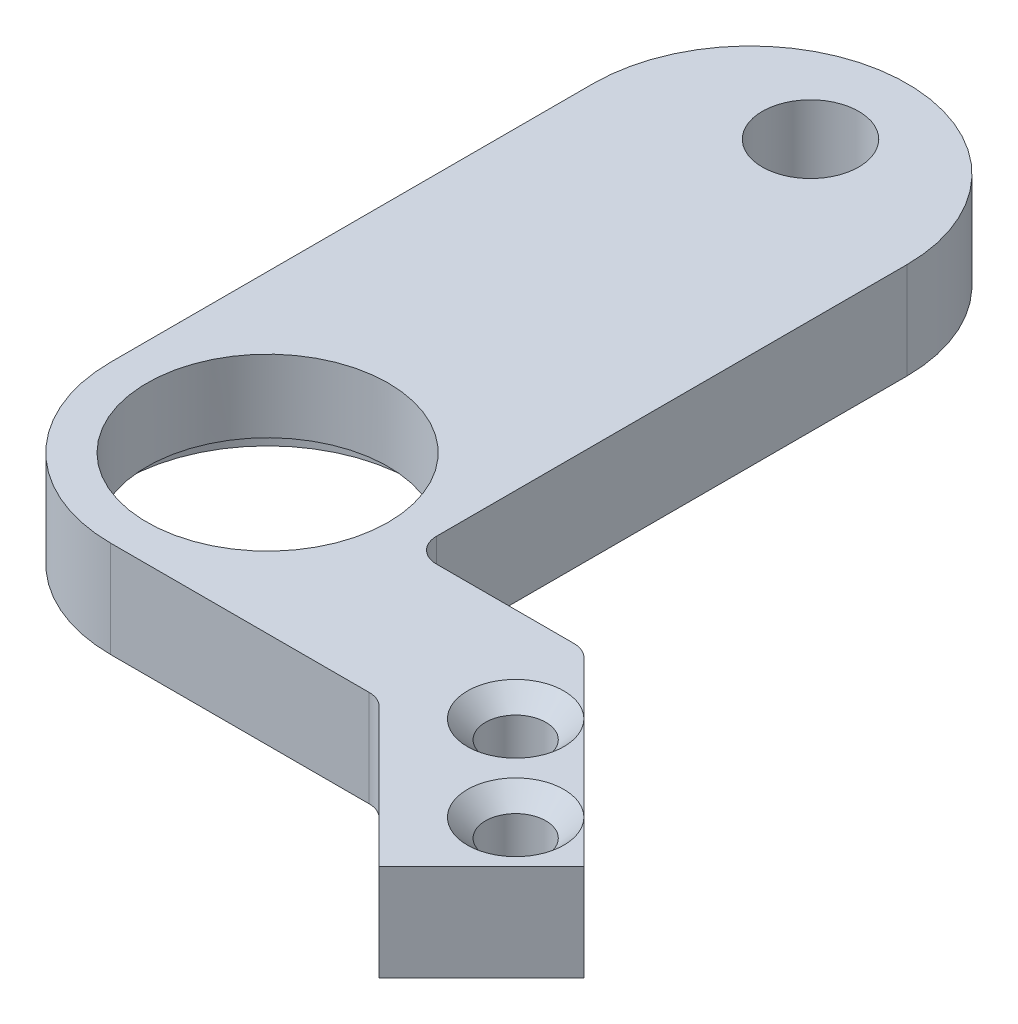
ISO-10303-21;
HEADER;
FILE_DESCRIPTION(('STEP AP214'),'2;1');
FILE_NAME('part.step','',(''),(''),'','','');
FILE_SCHEMA(('AUTOMOTIVE_DESIGN { 1 0 10303 214 1 1 1 1 }'));
ENDSEC;
DATA;
#1=APPLICATION_CONTEXT('core data for automotive mechanical design processes');
#2=APPLICATION_PROTOCOL_DEFINITION('international standard','automotive_design',2000,#1);
#3=PRODUCT_CONTEXT('',#1,'mechanical');
#4=PRODUCT('Part','Part','',(#3));
#5=PRODUCT_RELATED_PRODUCT_CATEGORY('part','',(#4));
#6=PRODUCT_DEFINITION_FORMATION('','',#4);
#7=PRODUCT_DEFINITION_CONTEXT('part definition',#1,'design');
#8=PRODUCT_DEFINITION('design','',#6,#7);
#9=PRODUCT_DEFINITION_SHAPE('','',#8);
#10=(LENGTH_UNIT() NAMED_UNIT(*) SI_UNIT(.MILLI.,.METRE.));
#11=(NAMED_UNIT(*) PLANE_ANGLE_UNIT() SI_UNIT($,.RADIAN.));
#12=(NAMED_UNIT(*) SI_UNIT($,.STERADIAN.) SOLID_ANGLE_UNIT());
#13=UNCERTAINTY_MEASURE_WITH_UNIT(LENGTH_MEASURE(1.E-05),#10,'distance_accuracy_value','');
#14=(GEOMETRIC_REPRESENTATION_CONTEXT(3) GLOBAL_UNCERTAINTY_ASSIGNED_CONTEXT((#13)) GLOBAL_UNIT_ASSIGNED_CONTEXT((#10,
#11,#12)) REPRESENTATION_CONTEXT('',''));
#15=CARTESIAN_POINT('',(0.,0.,0.));
#16=DIRECTION('',(0.,0.,1.));
#17=DIRECTION('',(1.,0.,0.));
#18=AXIS2_PLACEMENT_3D('',#15,#16,#17);
#19=CARTESIAN_POINT('',(2.53296168761796E-09,2.,0.));
#20=DIRECTION('',(0.,-1.,0.));
#21=DIRECTION('',(0.,0.,-1.));
#22=AXIS2_PLACEMENT_3D('',#19,#20,#21);
#23=PLANE('',#22);
#24=CARTESIAN_POINT('',(0.,2.,20.));
#25=DIRECTION('',(0.,-1.,0.));
#26=DIRECTION('',(0.,0.,-1.));
#27=AXIS2_PLACEMENT_3D('',#24,#25,#26);
#28=CIRCLE('',#27,5.);
#29=CARTESIAN_POINT('',(0.,2.,15.));
#30=VERTEX_POINT('',#29);
#31=EDGE_CURVE('E189',#30,#30,#28,.T.);
#32=ORIENTED_EDGE('',*,*,#31,.T.);
#33=EDGE_LOOP('',(#32));
#34=FACE_BOUND('',#33,.T.);
#35=CARTESIAN_POINT('',(0.,2.,-2.5));
#36=DIRECTION('',(0.,1.,0.));
#37=DIRECTION('',(0.,0.,1.));
#38=AXIS2_PLACEMENT_3D('',#35,#36,#37);
#39=CIRCLE('',#38,2.);
#40=CARTESIAN_POINT('',(0.,2.,-0.5));
#41=VERTEX_POINT('',#40);
#42=EDGE_CURVE('E250',#41,#41,#39,.T.);
#43=ORIENTED_EDGE('',*,*,#42,.F.);
#44=EDGE_LOOP('',(#43));
#45=FACE_BOUND('',#44,.T.);
#46=DIRECTION('',(0.707106781233644,0.,0.707106781139451));
#47=VECTOR('',#46,1.);
#48=CARTESIAN_POINT('',(-3.44519957965949,2.,3.44519958265138));
#49=LINE('',#48,#47);
#50=CARTESIAN_POINT('',(19.6421356238217,2.,26.5325347830571));
#51=VERTEX_POINT('',#50);
#52=CARTESIAN_POINT('',(21.409902577,2.,28.300301736));
#53=VERTEX_POINT('',#52);
#54=EDGE_CURVE('E156',#51,#53,#49,.T.);
#55=ORIENTED_EDGE('',*,*,#54,.F.);
#56=CARTESIAN_POINT('',(18.2279220615428,2.,27.9467483455244));
#57=DIRECTION('',(0.,1.,0.));
#58=DIRECTION('',(0.,0.,1.));
#59=AXIS2_PLACEMENT_3D('',#56,#57,#58);
#60=CIRCLE('',#59,2.);
#61=EDGE_CURVE('E45',#51,#51,#60,.T.);
#62=ORIENTED_EDGE('',*,*,#61,.F.);
#63=CARTESIAN_POINT('',(16.1066017176535,2.,22.9970008773599));
#64=VERTEX_POINT('',#63);
#65=EDGE_CURVE('E186',#64,#51,#49,.T.);
#66=ORIENTED_EDGE('',*,*,#65,.F.);
#67=CARTESIAN_POINT('',(14.6923881553746,2.,24.4112144398272));
#68=DIRECTION('',(0.,1.,0.));
#69=DIRECTION('',(0.,0.,1.));
#70=AXIS2_PLACEMENT_3D('',#67,#68,#69);
#71=CIRCLE('',#70,2.);
#72=EDGE_CURVE('E50',#64,#64,#71,.T.);
#73=ORIENTED_EDGE('',*,*,#72,.F.);
#74=CARTESIAN_POINT('',(13.9024940587664,2.,20.7928932187664));
#75=VERTEX_POINT('',#74);
#76=EDGE_CURVE('E159',#75,#64,#49,.T.);
#77=ORIENTED_EDGE('',*,*,#76,.F.);
#78=CARTESIAN_POINT('',(13.1953872776269,2.,21.5));
#79=DIRECTION('',(0.,-1.,0.));
#80=DIRECTION('',(0.,0.,-1.));
#81=AXIS2_PLACEMENT_3D('',#78,#79,#80);
#82=CIRCLE('',#81,0.999999999999998);
#83=CARTESIAN_POINT('',(13.1953872776269,2.,20.5));
#84=VERTEX_POINT('',#83);
#85=EDGE_CURVE('E213',#75,#84,#82,.F.);
#86=ORIENTED_EDGE('',*,*,#85,.T.);
#87=DIRECTION('',(1.,0.,0.));
#88=VECTOR('',#87,1.);
#89=CARTESIAN_POINT('',(6.50000000506592,2.,20.5));
#90=LINE('',#89,#88);
#91=CARTESIAN_POINT('',(7.50000000506592,2.,20.5));
#92=VERTEX_POINT('',#91);
#93=EDGE_CURVE('E150',#92,#84,#90,.T.);
#94=ORIENTED_EDGE('',*,*,#93,.F.);
#95=CARTESIAN_POINT('',(7.50000000506592,2.,19.5));
#96=DIRECTION('',(0.,-1.,0.));
#97=DIRECTION('',(0.,0.,-1.));
#98=AXIS2_PLACEMENT_3D('',#95,#96,#97);
#99=CIRCLE('',#98,0.999999999999998);
#100=CARTESIAN_POINT('',(6.50000000506592,2.,19.5));
#101=VERTEX_POINT('',#100);
#102=EDGE_CURVE('E217',#92,#101,#99,.T.);
#103=ORIENTED_EDGE('',*,*,#102,.T.);
#104=DIRECTION('',(0.,0.,1.));
#105=VECTOR('',#104,1.);
#106=CARTESIAN_POINT('',(6.50000000506592,2.,0.));
#107=LINE('',#106,#105);
#108=CARTESIAN_POINT('',(6.50000000506592,2.,0.));
#109=VERTEX_POINT('',#108);
#110=EDGE_CURVE('E148',#109,#101,#107,.T.);
#111=ORIENTED_EDGE('',*,*,#110,.F.);
#112=CARTESIAN_POINT('',(2.53296168761796E-09,2.,0.));
#113=DIRECTION('',(0.,-1.,0.));
#114=DIRECTION('',(0.,0.,-1.));
#115=AXIS2_PLACEMENT_3D('',#112,#113,#114);
#116=CIRCLE('',#115,6.50000000253296);
#117=CARTESIAN_POINT('',(-6.5,2.,0.));
#118=VERTEX_POINT('',#117);
#119=EDGE_CURVE('E134',#118,#109,#116,.T.);
#120=ORIENTED_EDGE('',*,*,#119,.F.);
#121=DIRECTION('',(0.,0.,-1.));
#122=VECTOR('',#121,1.);
#123=CARTESIAN_POINT('',(-6.5,2.,26.5));
#124=LINE('',#123,#122);
#125=CARTESIAN_POINT('',(-6.5,2.,20.));
#126=VERTEX_POINT('',#125);
#127=EDGE_CURVE('E124',#126,#118,#124,.T.);
#128=ORIENTED_EDGE('',*,*,#127,.F.);
#129=CARTESIAN_POINT('',(0.,2.,20.));
#130=DIRECTION('',(0.,-1.,0.));
#131=DIRECTION('',(0.,0.,-1.));
#132=AXIS2_PLACEMENT_3D('',#129,#130,#131);
#133=CIRCLE('',#132,6.5);
#134=CARTESIAN_POINT('',(0.,2.,26.5));
#135=VERTEX_POINT('',#134);
#136=EDGE_CURVE('E11',#126,#135,#133,.F.);
#137=ORIENTED_EDGE('',*,*,#136,.T.);
#138=DIRECTION('',(-1.,0.,0.));
#139=VECTOR('',#138,1.);
#140=CARTESIAN_POINT('',(11.1243194659491,2.,26.5));
#141=LINE('',#140,#139);
#142=CARTESIAN_POINT('',(10.7101059036269,2.,26.5));
#143=VERTEX_POINT('',#142);
#144=EDGE_CURVE('E135',#143,#135,#141,.T.);
#145=ORIENTED_EDGE('',*,*,#144,.F.);
#146=CARTESIAN_POINT('',(10.7101059036269,2.,27.5));
#147=DIRECTION('',(0.,-1.,0.));
#148=DIRECTION('',(0.,0.,-1.));
#149=AXIS2_PLACEMENT_3D('',#146,#147,#148);
#150=CIRCLE('',#149,0.999999999999998);
#151=CARTESIAN_POINT('',(11.417212684752,2.,26.792893218752));
#152=VERTEX_POINT('',#151);
#153=EDGE_CURVE('E221',#143,#152,#150,.T.);
#154=ORIENTED_EDGE('',*,*,#153,.T.);
#155=DIRECTION('',(-0.707106781248037,0.,-0.707106781125058));
#156=VECTOR('',#155,1.);
#157=CARTESIAN_POINT('',(-7.68784026672636,2.,7.68784027059639));
#158=LINE('',#157,#156);
#159=CARTESIAN_POINT('',(17.16726189,2.,32.542942423));
#160=VERTEX_POINT('',#159);
#161=EDGE_CURVE('E177',#160,#152,#158,.T.);
#162=ORIENTED_EDGE('',*,*,#161,.F.);
#163=DIRECTION('',(-0.707106781186546,0.,0.707106781186548));
#164=VECTOR('',#163,1.);
#165=CARTESIAN_POINT('',(13.609600839961,2.,36.100603473039));
#166=LINE('',#165,#164);
#167=EDGE_CURVE('E143',#53,#160,#166,.T.);
#168=ORIENTED_EDGE('',*,*,#167,.F.);
#169=EDGE_LOOP('',(#55,#62,#66,#73,#77,#86,#94,#103,#111,#120,#128,#137,#145,#154,#162,#168));
#170=FACE_BOUND('',#169,.T.);
#171=ADVANCED_FACE('F32',(#34,#45,#170),#23,.F.);
#172=CARTESIAN_POINT('',(11.1243194659491,2.,26.5));
#173=DIRECTION('',(-0.707106781125058,0.,0.707106781248037));
#174=DIRECTION('',(0.707106781248037,0.,0.707106781125058));
#175=AXIS2_PLACEMENT_3D('',#172,#173,#174);
#176=PLANE('',#175);
#177=ORIENTED_EDGE('',*,*,#161,.T.);
#178=DIRECTION('',(0.,-1.,0.));
#179=VECTOR('',#178,1.);
#180=CARTESIAN_POINT('',(11.417212684752,-2.,26.792893218752));
#181=LINE('',#180,#179);
#182=CARTESIAN_POINT('',(11.417212684752,-2.,26.792893218752));
#183=VERTEX_POINT('',#182);
#184=EDGE_CURVE('E204',#152,#183,#181,.T.);
#185=ORIENTED_EDGE('',*,*,#184,.T.);
#186=DIRECTION('',(-0.707106781248037,0.,-0.707106781125058));
#187=VECTOR('',#186,1.);
#188=CARTESIAN_POINT('',(-7.68784026672636,-2.,7.68784027059639));
#189=LINE('',#188,#187);
#190=CARTESIAN_POINT('',(17.16726189,-2.,32.542942423));
#191=VERTEX_POINT('',#190);
#192=EDGE_CURVE('E164',#191,#183,#189,.T.);
#193=ORIENTED_EDGE('',*,*,#192,.F.);
#194=DIRECTION('',(0.,-1.,0.));
#195=VECTOR('',#194,1.);
#196=CARTESIAN_POINT('',(17.16726189,2.,32.542942423));
#197=LINE('',#196,#195);
#198=EDGE_CURVE('E183',#160,#191,#197,.T.);
#199=ORIENTED_EDGE('',*,*,#198,.F.);
#200=EDGE_LOOP('',(#177,#185,#193,#199));
#201=FACE_BOUND('',#200,.T.);
#202=ADVANCED_FACE('F280',(#201),#176,.T.);
#203=CARTESIAN_POINT('',(13.609600839961,2.,36.100603473039));
#204=DIRECTION('',(0.707106781186549,0.,0.707106781186547));
#205=DIRECTION('',(0.707106781186546,0.,-0.707106781186549));
#206=AXIS2_PLACEMENT_3D('',#203,#204,#205);
#207=PLANE('',#206);
#208=DIRECTION('',(-0.707106781186546,0.,0.707106781186548));
#209=VECTOR('',#208,1.);
#210=CARTESIAN_POINT('',(13.609600839961,-2.,36.100603473039));
#211=LINE('',#210,#209);
#212=CARTESIAN_POINT('',(21.409902577,-2.,28.300301736));
#213=VERTEX_POINT('',#212);
#214=EDGE_CURVE('E174',#213,#191,#211,.T.);
#215=ORIENTED_EDGE('',*,*,#214,.F.);
#216=DIRECTION('',(0.,-1.,0.));
#217=VECTOR('',#216,1.);
#218=CARTESIAN_POINT('',(21.409902577,2.,28.300301736));
#219=LINE('',#218,#217);
#220=EDGE_CURVE('E178',#53,#213,#219,.T.);
#221=ORIENTED_EDGE('',*,*,#220,.F.);
#222=ORIENTED_EDGE('',*,*,#167,.T.);
#223=ORIENTED_EDGE('',*,*,#198,.T.);
#224=EDGE_LOOP('',(#215,#221,#222,#223));
#225=FACE_BOUND('',#224,.T.);
#226=ADVANCED_FACE('F286',(#225),#207,.T.);
#227=CARTESIAN_POINT('',(13.609600839961,2.,20.5));
#228=DIRECTION('',(0.707106781139451,0.,-0.707106781233644));
#229=DIRECTION('',(-0.707106781233644,0.,-0.707106781139451));
#230=AXIS2_PLACEMENT_3D('',#227,#228,#229);
#231=PLANE('',#230);
#232=DIRECTION('',(0.707106781233644,0.,0.707106781139451));
#233=VECTOR('',#232,1.);
#234=CARTESIAN_POINT('',(-3.44519957965949,-2.,3.44519958265138));
#235=LINE('',#234,#233);
#236=CARTESIAN_POINT('',(13.9024940587664,-2.,20.7928932187664));
#237=VERTEX_POINT('',#236);
#238=EDGE_CURVE('E173',#237,#213,#235,.T.);
#239=ORIENTED_EDGE('',*,*,#238,.F.);
#240=DIRECTION('',(0.,-1.,0.));
#241=VECTOR('',#240,1.);
#242=CARTESIAN_POINT('',(13.9024940587664,2.,20.7928932187664));
#243=LINE('',#242,#241);
#244=EDGE_CURVE('E211',#237,#75,#243,.F.);
#245=ORIENTED_EDGE('',*,*,#244,.T.);
#246=ORIENTED_EDGE('',*,*,#76,.T.);
#247=ORIENTED_EDGE('',*,*,#65,.T.);
#248=ORIENTED_EDGE('',*,*,#54,.T.);
#249=ORIENTED_EDGE('',*,*,#220,.T.);
#250=EDGE_LOOP('',(#239,#245,#246,#247,#248,#249));
#251=FACE_BOUND('',#250,.T.);
#252=ADVANCED_FACE('F300',(#251),#231,.T.);
#253=CARTESIAN_POINT('',(6.50000000506592,2.,20.5));
#254=DIRECTION('',(0.,0.,-1.));
#255=DIRECTION('',(-1.,0.,0.));
#256=AXIS2_PLACEMENT_3D('',#253,#254,#255);
#257=PLANE('',#256);
#258=DIRECTION('',(1.,0.,0.));
#259=VECTOR('',#258,1.);
#260=CARTESIAN_POINT('',(6.50000000506592,-2.,20.5));
#261=LINE('',#260,#259);
#262=CARTESIAN_POINT('',(7.50000000506592,-2.,20.5));
#263=VERTEX_POINT('',#262);
#264=CARTESIAN_POINT('',(13.1953872776269,-2.,20.5));
#265=VERTEX_POINT('',#264);
#266=EDGE_CURVE('E170',#263,#265,#261,.T.);
#267=ORIENTED_EDGE('',*,*,#266,.F.);
#268=DIRECTION('',(0.,-1.,0.));
#269=VECTOR('',#268,1.);
#270=CARTESIAN_POINT('',(7.50000000506592,2.,20.5));
#271=LINE('',#270,#269);
#272=EDGE_CURVE('E202',#263,#92,#271,.F.);
#273=ORIENTED_EDGE('',*,*,#272,.T.);
#274=ORIENTED_EDGE('',*,*,#93,.T.);
#275=DIRECTION('',(0.,-1.,0.));
#276=VECTOR('',#275,1.);
#277=CARTESIAN_POINT('',(13.1953872776269,2.,20.5));
#278=LINE('',#277,#276);
#279=EDGE_CURVE('E199',#84,#265,#278,.T.);
#280=ORIENTED_EDGE('',*,*,#279,.T.);
#281=EDGE_LOOP('',(#267,#273,#274,#280));
#282=FACE_BOUND('',#281,.T.);
#283=ADVANCED_FACE('F302',(#282),#257,.T.);
#284=CARTESIAN_POINT('',(6.50000000506592,2.,0.));
#285=DIRECTION('',(1.,0.,0.));
#286=DIRECTION('',(0.,0.,-1.));
#287=AXIS2_PLACEMENT_3D('',#284,#285,#286);
#288=PLANE('',#287);
#289=ORIENTED_EDGE('',*,*,#110,.T.);
#290=DIRECTION('',(0.,-1.,0.));
#291=VECTOR('',#290,1.);
#292=CARTESIAN_POINT('',(6.50000000506592,-2.,19.5));
#293=LINE('',#292,#291);
#294=CARTESIAN_POINT('',(6.50000000506592,-2.,19.5));
#295=VERTEX_POINT('',#294);
#296=EDGE_CURVE('E193',#101,#295,#293,.T.);
#297=ORIENTED_EDGE('',*,*,#296,.T.);
#298=DIRECTION('',(0.,0.,1.));
#299=VECTOR('',#298,1.);
#300=CARTESIAN_POINT('',(6.50000000506592,-2.,0.));
#301=LINE('',#300,#299);
#302=CARTESIAN_POINT('',(6.50000000506592,-2.,0.));
#303=VERTEX_POINT('',#302);
#304=EDGE_CURVE('E167',#303,#295,#301,.T.);
#305=ORIENTED_EDGE('',*,*,#304,.F.);
#306=DIRECTION('',(0.,-1.,0.));
#307=VECTOR('',#306,1.);
#308=CARTESIAN_POINT('',(6.50000000506592,2.,0.));
#309=LINE('',#308,#307);
#310=EDGE_CURVE('E142',#109,#303,#309,.T.);
#311=ORIENTED_EDGE('',*,*,#310,.F.);
#312=EDGE_LOOP('',(#289,#297,#305,#311));
#313=FACE_BOUND('',#312,.T.);
#314=ADVANCED_FACE('F305',(#313),#288,.T.);
#315=CARTESIAN_POINT('',(2.53296168761796E-09,2.,0.));
#316=DIRECTION('',(0.,-1.,0.));
#317=DIRECTION('',(0.,0.,-1.));
#318=AXIS2_PLACEMENT_3D('',#315,#316,#317);
#319=CYLINDRICAL_SURFACE('',#318,6.50000000253296);
#320=CARTESIAN_POINT('',(2.53296168761796E-09,-2.,0.));
#321=DIRECTION('',(0.,-1.,0.));
#322=DIRECTION('',(0.,0.,-1.));
#323=AXIS2_PLACEMENT_3D('',#320,#321,#322);
#324=CIRCLE('',#323,6.50000000253296);
#325=CARTESIAN_POINT('',(-6.5,-2.,0.));
#326=VERTEX_POINT('',#325);
#327=EDGE_CURVE('E141',#326,#303,#324,.T.);
#328=ORIENTED_EDGE('',*,*,#327,.F.);
#329=DIRECTION('',(0.,-1.,0.));
#330=VECTOR('',#329,1.);
#331=CARTESIAN_POINT('',(-6.5,2.,0.));
#332=LINE('',#331,#330);
#333=EDGE_CURVE('E128',#118,#326,#332,.T.);
#334=ORIENTED_EDGE('',*,*,#333,.F.);
#335=ORIENTED_EDGE('',*,*,#119,.T.);
#336=ORIENTED_EDGE('',*,*,#310,.T.);
#337=EDGE_LOOP('',(#328,#334,#335,#336));
#338=FACE_BOUND('',#337,.T.);
#339=ADVANCED_FACE('F139',(#338),#319,.T.);
#340=CARTESIAN_POINT('',(-6.5,2.,26.5));
#341=DIRECTION('',(-1.,0.,0.));
#342=DIRECTION('',(0.,0.,1.));
#343=AXIS2_PLACEMENT_3D('',#340,#341,#342);
#344=PLANE('',#343);
#345=DIRECTION('',(0.,0.,-1.));
#346=VECTOR('',#345,1.);
#347=CARTESIAN_POINT('',(-6.5,-2.,26.5));
#348=LINE('',#347,#346);
#349=CARTESIAN_POINT('',(-6.5,-2.,20.));
#350=VERTEX_POINT('',#349);
#351=EDGE_CURVE('E163',#350,#326,#348,.T.);
#352=ORIENTED_EDGE('',*,*,#351,.F.);
#353=DIRECTION('',(0.,-1.,0.));
#354=VECTOR('',#353,1.);
#355=CARTESIAN_POINT('',(-6.5,2.,20.));
#356=LINE('',#355,#354);
#357=EDGE_CURVE('E40',#350,#126,#356,.F.);
#358=ORIENTED_EDGE('',*,*,#357,.T.);
#359=ORIENTED_EDGE('',*,*,#127,.T.);
#360=ORIENTED_EDGE('',*,*,#333,.T.);
#361=EDGE_LOOP('',(#352,#358,#359,#360));
#362=FACE_BOUND('',#361,.T.);
#363=ADVANCED_FACE('F127',(#362),#344,.T.);
#364=CARTESIAN_POINT('',(11.1243194659491,2.,26.5));
#365=DIRECTION('',(0.,0.,1.));
#366=DIRECTION('',(1.,0.,0.));
#367=AXIS2_PLACEMENT_3D('',#364,#365,#366);
#368=PLANE('',#367);
#369=ORIENTED_EDGE('',*,*,#144,.T.);
#370=DIRECTION('',(0.,-1.,0.));
#371=VECTOR('',#370,1.);
#372=CARTESIAN_POINT('',(0.,2.,26.5));
#373=LINE('',#372,#371);
#374=CARTESIAN_POINT('',(0.,-2.,26.5));
#375=VERTEX_POINT('',#374);
#376=EDGE_CURVE('E223',#135,#375,#373,.T.);
#377=ORIENTED_EDGE('',*,*,#376,.T.);
#378=DIRECTION('',(-1.,0.,0.));
#379=VECTOR('',#378,1.);
#380=CARTESIAN_POINT('',(11.1243194659491,-2.,26.5));
#381=LINE('',#380,#379);
#382=CARTESIAN_POINT('',(10.7101059036269,-2.,26.5));
#383=VERTEX_POINT('',#382);
#384=EDGE_CURVE('E160',#383,#375,#381,.T.);
#385=ORIENTED_EDGE('',*,*,#384,.F.);
#386=DIRECTION('',(0.,-1.,0.));
#387=VECTOR('',#386,1.);
#388=CARTESIAN_POINT('',(10.7101059036269,2.,26.5));
#389=LINE('',#388,#387);
#390=EDGE_CURVE('E207',#383,#143,#389,.F.);
#391=ORIENTED_EDGE('',*,*,#390,.T.);
#392=EDGE_LOOP('',(#369,#377,#385,#391));
#393=FACE_BOUND('',#392,.T.);
#394=ADVANCED_FACE('F236',(#393),#368,.T.);
#395=CARTESIAN_POINT('',(2.53296168761796E-09,-2.,0.));
#396=DIRECTION('',(0.,-1.,0.));
#397=DIRECTION('',(0.,0.,-1.));
#398=AXIS2_PLACEMENT_3D('',#395,#396,#397);
#399=PLANE('',#398);
#400=CARTESIAN_POINT('',(18.2279220615428,-2.,27.9467483455244));
#401=DIRECTION('',(0.,1.,0.));
#402=DIRECTION('',(0.,0.,1.));
#403=AXIS2_PLACEMENT_3D('',#400,#401,#402);
#404=CIRCLE('',#403,1.25);
#405=CARTESIAN_POINT('',(18.2279220615428,-2.,29.1967483455244));
#406=VERTEX_POINT('',#405);
#407=EDGE_CURVE('E260',#406,#406,#404,.T.);
#408=ORIENTED_EDGE('',*,*,#407,.T.);
#409=EDGE_LOOP('',(#408));
#410=FACE_BOUND('',#409,.T.);
#411=CARTESIAN_POINT('',(14.6923881553746,-2.,24.4112144398272));
#412=DIRECTION('',(0.,1.,0.));
#413=DIRECTION('',(0.,0.,1.));
#414=AXIS2_PLACEMENT_3D('',#411,#412,#413);
#415=CIRCLE('',#414,1.25);
#416=CARTESIAN_POINT('',(14.6923881553746,-2.,25.6612144398272));
#417=VERTEX_POINT('',#416);
#418=EDGE_CURVE('E253',#417,#417,#415,.T.);
#419=ORIENTED_EDGE('',*,*,#418,.T.);
#420=EDGE_LOOP('',(#419));
#421=FACE_BOUND('',#420,.T.);
#422=CARTESIAN_POINT('',(0.,-2.,-2.5));
#423=DIRECTION('',(0.,1.,0.));
#424=DIRECTION('',(0.,0.,1.));
#425=AXIS2_PLACEMENT_3D('',#422,#423,#424);
#426=CIRCLE('',#425,2.);
#427=CARTESIAN_POINT('',(0.,-2.,-0.500000000000001));
#428=VERTEX_POINT('',#427);
#429=EDGE_CURVE('E247',#428,#428,#426,.T.);
#430=ORIENTED_EDGE('',*,*,#429,.T.);
#431=EDGE_LOOP('',(#430));
#432=FACE_BOUND('',#431,.T.);
#433=CARTESIAN_POINT('',(0.,-2.,20.));
#434=DIRECTION('',(0.,-1.,0.));
#435=DIRECTION('',(1.,0.,0.));
#436=AXIS2_PLACEMENT_3D('',#433,#434,#435);
#437=CIRCLE('',#436,6.);
#438=CARTESIAN_POINT('',(6.,-2.,20.));
#439=VERTEX_POINT('',#438);
#440=EDGE_CURVE('E196',#439,#439,#437,.T.);
#441=ORIENTED_EDGE('',*,*,#440,.F.);
#442=EDGE_LOOP('',(#441));
#443=FACE_BOUND('',#442,.T.);
#444=ORIENTED_EDGE('',*,*,#384,.T.);
#445=CARTESIAN_POINT('',(0.,-2.,20.));
#446=DIRECTION('',(0.,-1.,0.));
#447=DIRECTION('',(0.,0.,-1.));
#448=AXIS2_PLACEMENT_3D('',#445,#446,#447);
#449=CIRCLE('',#448,6.5);
#450=EDGE_CURVE('E226',#375,#350,#449,.T.);
#451=ORIENTED_EDGE('',*,*,#450,.T.);
#452=ORIENTED_EDGE('',*,*,#351,.T.);
#453=ORIENTED_EDGE('',*,*,#327,.T.);
#454=ORIENTED_EDGE('',*,*,#304,.T.);
#455=CARTESIAN_POINT('',(7.50000000506592,-2.,19.5));
#456=DIRECTION('',(0.,-1.,0.));
#457=DIRECTION('',(0.,0.,-1.));
#458=AXIS2_PLACEMENT_3D('',#455,#456,#457);
#459=CIRCLE('',#458,0.999999999999998);
#460=EDGE_CURVE('E215',#295,#263,#459,.F.);
#461=ORIENTED_EDGE('',*,*,#460,.T.);
#462=ORIENTED_EDGE('',*,*,#266,.T.);
#463=CARTESIAN_POINT('',(13.1953872776269,-2.,21.5));
#464=DIRECTION('',(0.,-1.,0.));
#465=DIRECTION('',(0.,0.,-1.));
#466=AXIS2_PLACEMENT_3D('',#463,#464,#465);
#467=CIRCLE('',#466,0.999999999999998);
#468=EDGE_CURVE('E209',#265,#237,#467,.T.);
#469=ORIENTED_EDGE('',*,*,#468,.T.);
#470=ORIENTED_EDGE('',*,*,#238,.T.);
#471=ORIENTED_EDGE('',*,*,#214,.T.);
#472=ORIENTED_EDGE('',*,*,#192,.T.);
#473=CARTESIAN_POINT('',(10.7101059036269,-2.,27.5));
#474=DIRECTION('',(0.,-1.,0.));
#475=DIRECTION('',(0.,0.,-1.));
#476=AXIS2_PLACEMENT_3D('',#473,#474,#475);
#477=CIRCLE('',#476,0.999999999999998);
#478=EDGE_CURVE('E219',#183,#383,#477,.F.);
#479=ORIENTED_EDGE('',*,*,#478,.T.);
#480=EDGE_LOOP('',(#444,#451,#452,#453,#454,#461,#462,#469,#470,#471,#472,#479));
#481=FACE_BOUND('',#480,.T.);
#482=ADVANCED_FACE('F228',(#410,#421,#432,#443,#481),#399,.T.);
#483=CARTESIAN_POINT('',(0.,3.19546402458537,20.));
#484=DIRECTION('',(0.,-1.,0.));
#485=DIRECTION('',(1.,0.,0.));
#486=AXIS2_PLACEMENT_3D('',#483,#484,#485);
#487=CYLINDRICAL_SURFACE('',#486,5.);
#488=CARTESIAN_POINT('',(0.,-1.,20.));
#489=DIRECTION('',(0.,-1.,0.));
#490=DIRECTION('',(1.,0.,0.));
#491=AXIS2_PLACEMENT_3D('',#488,#489,#490);
#492=CIRCLE('',#491,5.);
#493=CARTESIAN_POINT('',(5.,-1.,20.));
#494=VERTEX_POINT('',#493);
#495=EDGE_CURVE('E244',#494,#494,#492,.T.);
#496=ORIENTED_EDGE('',*,*,#495,.T.);
#497=EDGE_LOOP('',(#496));
#498=FACE_BOUND('',#497,.T.);
#499=ORIENTED_EDGE('',*,*,#31,.F.);
#500=EDGE_LOOP('',(#499));
#501=FACE_BOUND('',#500,.T.);
#502=ADVANCED_FACE('F296',(#498,#501),#487,.F.);
#503=CARTESIAN_POINT('',(0.,3.19546402458537,20.));
#504=DIRECTION('',(0.,-1.,0.));
#505=DIRECTION('',(1.,0.,0.));
#506=AXIS2_PLACEMENT_3D('',#503,#504,#505);
#507=CYLINDRICAL_SURFACE('',#506,6.);
#508=CARTESIAN_POINT('',(0.,-1.,20.));
#509=DIRECTION('',(0.,-1.,0.));
#510=DIRECTION('',(1.,0.,0.));
#511=AXIS2_PLACEMENT_3D('',#508,#509,#510);
#512=CIRCLE('',#511,6.);
#513=CARTESIAN_POINT('',(6.,-1.,20.));
#514=VERTEX_POINT('',#513);
#515=EDGE_CURVE('E241',#514,#514,#512,.T.);
#516=ORIENTED_EDGE('',*,*,#515,.F.);
#517=EDGE_LOOP('',(#516));
#518=FACE_BOUND('',#517,.T.);
#519=ORIENTED_EDGE('',*,*,#440,.T.);
#520=EDGE_LOOP('',(#519));
#521=FACE_BOUND('',#520,.T.);
#522=ADVANCED_FACE('F292',(#518,#521),#507,.F.);
#523=CARTESIAN_POINT('',(6.,-1.,20.));
#524=DIRECTION('',(0.,1.,0.));
#525=DIRECTION('',(-1.,0.,0.));
#526=AXIS2_PLACEMENT_3D('',#523,#524,#525);
#527=PLANE('',#526);
#528=ORIENTED_EDGE('',*,*,#495,.F.);
#529=EDGE_LOOP('',(#528));
#530=FACE_BOUND('',#529,.T.);
#531=ORIENTED_EDGE('',*,*,#515,.T.);
#532=EDGE_LOOP('',(#531));
#533=FACE_BOUND('',#532,.T.);
#534=ADVANCED_FACE('F368',(#530,#533),#527,.F.);
#535=CARTESIAN_POINT('',(0.,2.,-2.5));
#536=DIRECTION('',(0.,1.,0.));
#537=DIRECTION('',(0.,0.,1.));
#538=AXIS2_PLACEMENT_3D('',#535,#536,#537);
#539=CYLINDRICAL_SURFACE('',#538,2.);
#540=ORIENTED_EDGE('',*,*,#429,.F.);
#541=EDGE_LOOP('',(#540));
#542=FACE_BOUND('',#541,.T.);
#543=ORIENTED_EDGE('',*,*,#42,.T.);
#544=EDGE_LOOP('',(#543));
#545=FACE_BOUND('',#544,.T.);
#546=ADVANCED_FACE('F323',(#542,#545),#539,.F.);
#547=CARTESIAN_POINT('',(7.50000000506592,2.,19.5));
#548=DIRECTION('',(0.,1.,0.));
#549=DIRECTION('',(0.,0.,1.));
#550=AXIS2_PLACEMENT_3D('',#547,#548,#549);
#551=CYLINDRICAL_SURFACE('',#550,0.999999999999998);
#552=ORIENTED_EDGE('',*,*,#102,.F.);
#553=ORIENTED_EDGE('',*,*,#272,.F.);
#554=ORIENTED_EDGE('',*,*,#460,.F.);
#555=ORIENTED_EDGE('',*,*,#296,.F.);
#556=EDGE_LOOP('',(#552,#553,#554,#555));
#557=FACE_BOUND('',#556,.T.);
#558=ADVANCED_FACE('F319',(#557),#551,.F.);
#559=CARTESIAN_POINT('',(10.7101059036269,2.,27.5));
#560=DIRECTION('',(0.,1.,0.));
#561=DIRECTION('',(0.,0.,1.));
#562=AXIS2_PLACEMENT_3D('',#559,#560,#561);
#563=CYLINDRICAL_SURFACE('',#562,0.999999999999998);
#564=ORIENTED_EDGE('',*,*,#153,.F.);
#565=ORIENTED_EDGE('',*,*,#390,.F.);
#566=ORIENTED_EDGE('',*,*,#478,.F.);
#567=ORIENTED_EDGE('',*,*,#184,.F.);
#568=EDGE_LOOP('',(#564,#565,#566,#567));
#569=FACE_BOUND('',#568,.T.);
#570=ADVANCED_FACE('F322',(#569),#563,.F.);
#571=CARTESIAN_POINT('',(13.1953872776269,2.,21.5));
#572=DIRECTION('',(0.,-1.,0.));
#573=DIRECTION('',(0.,0.,-1.));
#574=AXIS2_PLACEMENT_3D('',#571,#572,#573);
#575=CYLINDRICAL_SURFACE('',#574,0.999999999999998);
#576=ORIENTED_EDGE('',*,*,#85,.F.);
#577=ORIENTED_EDGE('',*,*,#244,.F.);
#578=ORIENTED_EDGE('',*,*,#468,.F.);
#579=ORIENTED_EDGE('',*,*,#279,.F.);
#580=EDGE_LOOP('',(#576,#577,#578,#579));
#581=FACE_BOUND('',#580,.T.);
#582=ADVANCED_FACE('F326',(#581),#575,.T.);
#583=CARTESIAN_POINT('',(0.,2.,20.));
#584=DIRECTION('',(0.,-1.,0.));
#585=DIRECTION('',(0.,0.,-1.));
#586=AXIS2_PLACEMENT_3D('',#583,#584,#585);
#587=CYLINDRICAL_SURFACE('',#586,6.5);
#588=ORIENTED_EDGE('',*,*,#136,.F.);
#589=ORIENTED_EDGE('',*,*,#357,.F.);
#590=ORIENTED_EDGE('',*,*,#450,.F.);
#591=ORIENTED_EDGE('',*,*,#376,.F.);
#592=EDGE_LOOP('',(#588,#589,#590,#591));
#593=FACE_BOUND('',#592,.T.);
#594=ADVANCED_FACE('F34',(#593),#587,.T.);
#595=CARTESIAN_POINT('',(14.6923881553746,2.,24.4112144398272));
#596=DIRECTION('',(0.,1.,0.));
#597=DIRECTION('',(0.,0.,1.));
#598=AXIS2_PLACEMENT_3D('',#595,#596,#597);
#599=CYLINDRICAL_SURFACE('',#598,1.24999999999999);
#600=ORIENTED_EDGE('',*,*,#418,.F.);
#601=EDGE_LOOP('',(#600));
#602=FACE_BOUND('',#601,.T.);
#603=CARTESIAN_POINT('',(14.6923881553746,1.24999999999999,24.4112144398272));
#604=DIRECTION('',(0.,1.,0.));
#605=DIRECTION('',(0.,0.,1.));
#606=AXIS2_PLACEMENT_3D('',#603,#604,#605);
#607=CIRCLE('',#606,1.24999999999999);
#608=CARTESIAN_POINT('',(14.6923881553746,1.24999999999999,25.6612144398272));
#609=VERTEX_POINT('',#608);
#610=EDGE_CURVE('E256',#609,#609,#607,.T.);
#611=ORIENTED_EDGE('',*,*,#610,.T.);
#612=EDGE_LOOP('',(#611));
#613=FACE_BOUND('',#612,.T.);
#614=ADVANCED_FACE('F333',(#602,#613),#599,.F.);
#615=CARTESIAN_POINT('',(14.6923881553746,2.,24.4112144398272));
#616=DIRECTION('',(0.,1.,0.));
#617=DIRECTION('',(0.,0.,1.));
#618=AXIS2_PLACEMENT_3D('',#615,#616,#617);
#619=CONICAL_SURFACE('',#618,2.,0.785398163397447);
#620=ORIENTED_EDGE('',*,*,#610,.F.);
#621=EDGE_LOOP('',(#620));
#622=FACE_BOUND('',#621,.T.);
#623=ORIENTED_EDGE('',*,*,#72,.T.);
#624=EDGE_LOOP('',(#623));
#625=FACE_BOUND('',#624,.T.);
#626=ADVANCED_FACE('F276',(#622,#625),#619,.F.);
#627=CARTESIAN_POINT('',(18.2279220615428,2.,27.9467483455244));
#628=DIRECTION('',(0.,1.,0.));
#629=DIRECTION('',(0.,0.,1.));
#630=AXIS2_PLACEMENT_3D('',#627,#628,#629);
#631=CYLINDRICAL_SURFACE('',#630,1.24999999999999);
#632=ORIENTED_EDGE('',*,*,#407,.F.);
#633=EDGE_LOOP('',(#632));
#634=FACE_BOUND('',#633,.T.);
#635=CARTESIAN_POINT('',(18.2279220615428,1.24999999999999,27.9467483455244));
#636=DIRECTION('',(0.,1.,0.));
#637=DIRECTION('',(0.,0.,1.));
#638=AXIS2_PLACEMENT_3D('',#635,#636,#637);
#639=CIRCLE('',#638,1.24999999999999);
#640=CARTESIAN_POINT('',(18.2279220615428,1.24999999999999,29.1967483455244));
#641=VERTEX_POINT('',#640);
#642=EDGE_CURVE('E263',#641,#641,#639,.T.);
#643=ORIENTED_EDGE('',*,*,#642,.T.);
#644=EDGE_LOOP('',(#643));
#645=FACE_BOUND('',#644,.T.);
#646=ADVANCED_FACE('F268',(#634,#645),#631,.F.);
#647=CARTESIAN_POINT('',(18.2279220615428,2.,27.9467483455244));
#648=DIRECTION('',(0.,1.,0.));
#649=DIRECTION('',(0.,0.,1.));
#650=AXIS2_PLACEMENT_3D('',#647,#648,#649);
#651=CONICAL_SURFACE('',#650,2.,0.785398163397445);
#652=ORIENTED_EDGE('',*,*,#642,.F.);
#653=EDGE_LOOP('',(#652));
#654=FACE_BOUND('',#653,.T.);
#655=ORIENTED_EDGE('',*,*,#61,.T.);
#656=EDGE_LOOP('',(#655));
#657=FACE_BOUND('',#656,.T.);
#658=ADVANCED_FACE('F270',(#654,#657),#651,.F.);
#659=CLOSED_SHELL('',(#171,#202,#226,#252,#283,#314,#339,#363,#394,#482,#502,#522,#534,#546,
#558,#570,#582,#594,#614,#626,#646,#658));
#660=MANIFOLD_SOLID_BREP('B2',#659);
#661=ADVANCED_BREP_SHAPE_REPRESENTATION('',(#18,#660),#14);
#662=SHAPE_DEFINITION_REPRESENTATION(#9,#661);
ENDSEC;
END-ISO-10303-21;
